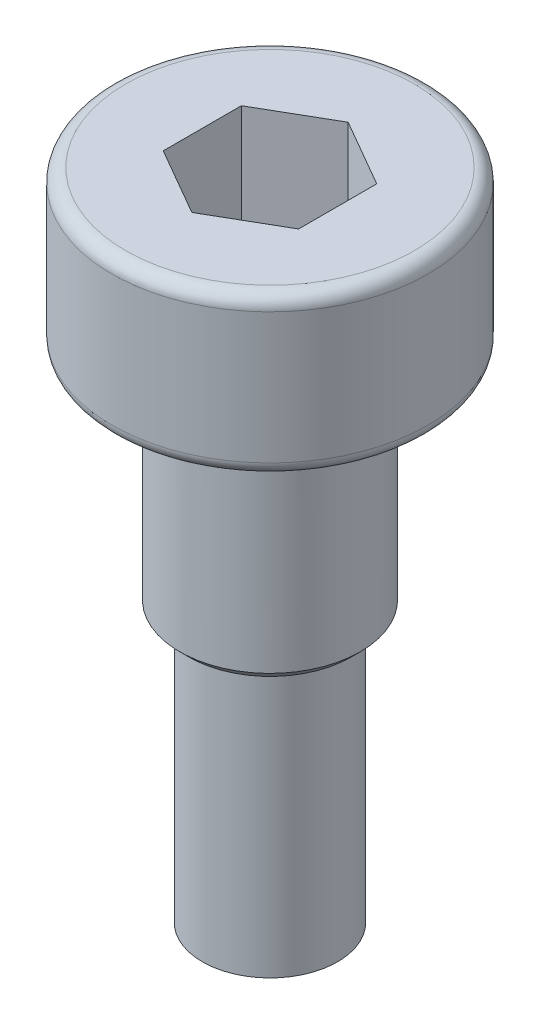
ISO-10303-21;
HEADER;
FILE_DESCRIPTION(('STEP AP214'),'2;1');
FILE_NAME('part.step','',(''),(''),'','','');
FILE_SCHEMA(('AUTOMOTIVE_DESIGN { 1 0 10303 214 1 1 1 1 }'));
ENDSEC;
DATA;
#1=APPLICATION_CONTEXT('core data for automotive mechanical design processes');
#2=APPLICATION_PROTOCOL_DEFINITION('international standard','automotive_design',2000,#1);
#3=PRODUCT_CONTEXT('',#1,'mechanical');
#4=PRODUCT('Part','Part','',(#3));
#5=PRODUCT_RELATED_PRODUCT_CATEGORY('part','',(#4));
#6=PRODUCT_DEFINITION_FORMATION('','',#4);
#7=PRODUCT_DEFINITION_CONTEXT('part definition',#1,'design');
#8=PRODUCT_DEFINITION('design','',#6,#7);
#9=PRODUCT_DEFINITION_SHAPE('','',#8);
#10=(LENGTH_UNIT() NAMED_UNIT(*) SI_UNIT(.MILLI.,.METRE.));
#11=(NAMED_UNIT(*) PLANE_ANGLE_UNIT() SI_UNIT($,.RADIAN.));
#12=(NAMED_UNIT(*) SI_UNIT($,.STERADIAN.) SOLID_ANGLE_UNIT());
#13=UNCERTAINTY_MEASURE_WITH_UNIT(LENGTH_MEASURE(1.E-05),#10,'distance_accuracy_value','');
#14=(GEOMETRIC_REPRESENTATION_CONTEXT(3) GLOBAL_UNCERTAINTY_ASSIGNED_CONTEXT((#13)) GLOBAL_UNIT_ASSIGNED_CONTEXT((#10,
#11,#12)) REPRESENTATION_CONTEXT('',''));
#15=CARTESIAN_POINT('',(0.,0.,0.));
#16=DIRECTION('',(0.,0.,1.));
#17=DIRECTION('',(1.,0.,0.));
#18=AXIS2_PLACEMENT_3D('',#15,#16,#17);
#19=CARTESIAN_POINT('',(0.,3.5,0.));
#20=DIRECTION('',(0.,1.,0.));
#21=DIRECTION('',(-1.,0.,0.));
#22=AXIS2_PLACEMENT_3D('',#19,#20,#21);
#23=PLANE('',#22);
#24=DIRECTION('',(-0.866025403784439,0.,-0.5));
#25=VECTOR('',#24,1.);
#26=CARTESIAN_POINT('',(1.5,3.5,-0.86602540378444));
#27=LINE('',#26,#25);
#28=CARTESIAN_POINT('',(1.5,3.5,-0.86602540378444));
#29=VERTEX_POINT('',#28);
#30=CARTESIAN_POINT('',(0.,3.5,-1.73205080756888));
#31=VERTEX_POINT('',#30);
#32=EDGE_CURVE('E57',#29,#31,#27,.T.);
#33=ORIENTED_EDGE('',*,*,#32,.F.);
#34=DIRECTION('',(0.,0.,-1.));
#35=VECTOR('',#34,1.);
#36=CARTESIAN_POINT('',(1.5,3.5,0.866025403784439));
#37=LINE('',#36,#35);
#38=CARTESIAN_POINT('',(1.5,3.5,0.866025403784439));
#39=VERTEX_POINT('',#38);
#40=EDGE_CURVE('E140',#39,#29,#37,.T.);
#41=ORIENTED_EDGE('',*,*,#40,.F.);
#42=DIRECTION('',(0.866025403784439,0.,-0.5));
#43=VECTOR('',#42,1.);
#44=CARTESIAN_POINT('',(0.,3.5,1.73205080756888));
#45=LINE('',#44,#43);
#46=CARTESIAN_POINT('',(0.,3.5,1.73205080756888));
#47=VERTEX_POINT('',#46);
#48=EDGE_CURVE('E138',#47,#39,#45,.T.);
#49=ORIENTED_EDGE('',*,*,#48,.F.);
#50=DIRECTION('',(0.866025403784438,0.,0.5));
#51=VECTOR('',#50,1.);
#52=CARTESIAN_POINT('',(-1.5,3.5,0.866025403784439));
#53=LINE('',#52,#51);
#54=CARTESIAN_POINT('',(-1.5,3.5,0.866025403784439));
#55=VERTEX_POINT('',#54);
#56=EDGE_CURVE('E105',#55,#47,#53,.T.);
#57=ORIENTED_EDGE('',*,*,#56,.F.);
#58=DIRECTION('',(0.,0.,1.));
#59=VECTOR('',#58,1.);
#60=CARTESIAN_POINT('',(-1.5,3.5,-0.866025403784439));
#61=LINE('',#60,#59);
#62=CARTESIAN_POINT('',(-1.5,3.5,-0.866025403784439));
#63=VERTEX_POINT('',#62);
#64=EDGE_CURVE('E134',#63,#55,#61,.T.);
#65=ORIENTED_EDGE('',*,*,#64,.F.);
#66=DIRECTION('',(-0.866025403784439,0.,0.5));
#67=VECTOR('',#66,1.);
#68=CARTESIAN_POINT('',(0.,3.5,-1.73205080756888));
#69=LINE('',#68,#67);
#70=EDGE_CURVE('E131',#31,#63,#69,.T.);
#71=ORIENTED_EDGE('',*,*,#70,.F.);
#72=EDGE_LOOP('',(#33,#41,#49,#57,#65,#71));
#73=FACE_BOUND('',#72,.T.);
#74=CARTESIAN_POINT('',(0.,3.5,0.));
#75=DIRECTION('',(0.,1.,0.));
#76=DIRECTION('',(-1.,0.,0.));
#77=AXIS2_PLACEMENT_3D('',#74,#75,#76);
#78=CIRCLE('',#77,3.2);
#79=CARTESIAN_POINT('',(-3.2,3.5,0.));
#80=VERTEX_POINT('',#79);
#81=EDGE_CURVE('E167',#80,#80,#78,.T.);
#82=ORIENTED_EDGE('',*,*,#81,.T.);
#83=EDGE_LOOP('',(#82));
#84=FACE_BOUND('',#83,.T.);
#85=ADVANCED_FACE('F41',(#73,#84),#23,.T.);
#86=CARTESIAN_POINT('',(0.,3.5,0.));
#87=DIRECTION('',(0.,1.,0.));
#88=DIRECTION('',(-1.,0.,0.));
#89=AXIS2_PLACEMENT_3D('',#86,#87,#88);
#90=CYLINDRICAL_SURFACE('',#89,3.5);
#91=CARTESIAN_POINT('',(0.,0.3,0.));
#92=DIRECTION('',(0.,-1.,0.));
#93=DIRECTION('',(1.,0.,0.));
#94=AXIS2_PLACEMENT_3D('',#91,#92,#93);
#95=CIRCLE('',#94,3.5);
#96=CARTESIAN_POINT('',(3.5,0.3,0.));
#97=VERTEX_POINT('',#96);
#98=EDGE_CURVE('E161',#97,#97,#95,.F.);
#99=ORIENTED_EDGE('',*,*,#98,.T.);
#100=EDGE_LOOP('',(#99));
#101=FACE_BOUND('',#100,.T.);
#102=CARTESIAN_POINT('',(0.,3.2,0.));
#103=DIRECTION('',(0.,1.,0.));
#104=DIRECTION('',(-1.,0.,0.));
#105=AXIS2_PLACEMENT_3D('',#102,#103,#104);
#106=CIRCLE('',#105,3.5);
#107=CARTESIAN_POINT('',(-3.5,3.2,0.));
#108=VERTEX_POINT('',#107);
#109=EDGE_CURVE('E158',#108,#108,#106,.F.);
#110=ORIENTED_EDGE('',*,*,#109,.T.);
#111=EDGE_LOOP('',(#110));
#112=FACE_BOUND('',#111,.T.);
#113=ADVANCED_FACE('F184',(#101,#112),#90,.T.);
#114=CARTESIAN_POINT('',(-3.5,0.,0.));
#115=DIRECTION('',(0.,-1.,0.));
#116=DIRECTION('',(1.,0.,0.));
#117=AXIS2_PLACEMENT_3D('',#114,#115,#116);
#118=PLANE('',#117);
#119=CARTESIAN_POINT('',(0.,0.,0.));
#120=DIRECTION('',(0.,-1.,0.));
#121=DIRECTION('',(1.,0.,0.));
#122=AXIS2_PLACEMENT_3D('',#119,#120,#121);
#123=CIRCLE('',#122,3.2);
#124=CARTESIAN_POINT('',(3.2,0.,0.));
#125=VERTEX_POINT('',#124);
#126=EDGE_CURVE('E164',#125,#125,#123,.T.);
#127=ORIENTED_EDGE('',*,*,#126,.T.);
#128=EDGE_LOOP('',(#127));
#129=FACE_BOUND('',#128,.T.);
#130=CARTESIAN_POINT('',(0.,0.,0.));
#131=DIRECTION('',(0.,1.,0.));
#132=DIRECTION('',(-1.,0.,0.));
#133=AXIS2_PLACEMENT_3D('',#130,#131,#132);
#134=CIRCLE('',#133,2.);
#135=CARTESIAN_POINT('',(-2.,0.,0.));
#136=VERTEX_POINT('',#135);
#137=EDGE_CURVE('E155',#136,#136,#134,.T.);
#138=ORIENTED_EDGE('',*,*,#137,.T.);
#139=EDGE_LOOP('',(#138));
#140=FACE_BOUND('',#139,.T.);
#141=ADVANCED_FACE('F190',(#129,#140),#118,.T.);
#142=CARTESIAN_POINT('',(0.,3.5,0.));
#143=DIRECTION('',(0.,1.,0.));
#144=DIRECTION('',(-1.,0.,0.));
#145=AXIS2_PLACEMENT_3D('',#142,#143,#144);
#146=CYLINDRICAL_SURFACE('',#145,2.);
#147=CARTESIAN_POINT('',(0.,-4.8,0.));
#148=DIRECTION('',(0.,-1.,0.));
#149=DIRECTION('',(1.,0.,0.));
#150=AXIS2_PLACEMENT_3D('',#147,#148,#149);
#151=CIRCLE('',#150,2.);
#152=CARTESIAN_POINT('',(2.,-4.8,0.));
#153=VERTEX_POINT('',#152);
#154=EDGE_CURVE('E50',#153,#153,#151,.F.);
#155=ORIENTED_EDGE('',*,*,#154,.T.);
#156=EDGE_LOOP('',(#155));
#157=FACE_BOUND('',#156,.T.);
#158=ORIENTED_EDGE('',*,*,#137,.F.);
#159=EDGE_LOOP('',(#158));
#160=FACE_BOUND('',#159,.T.);
#161=ADVANCED_FACE('F172',(#157,#160),#146,.T.);
#162=CARTESIAN_POINT('',(-2.,-5.,0.));
#163=DIRECTION('',(0.,-1.,0.));
#164=DIRECTION('',(1.,0.,0.));
#165=AXIS2_PLACEMENT_3D('',#162,#163,#164);
#166=PLANE('',#165);
#167=CARTESIAN_POINT('',(0.,-5.,0.));
#168=DIRECTION('',(0.,-1.,0.));
#169=DIRECTION('',(1.,0.,0.));
#170=AXIS2_PLACEMENT_3D('',#167,#168,#169);
#171=CIRCLE('',#170,1.8);
#172=CARTESIAN_POINT('',(1.8,-5.,0.));
#173=VERTEX_POINT('',#172);
#174=EDGE_CURVE('E11',#173,#173,#171,.T.);
#175=ORIENTED_EDGE('',*,*,#174,.T.);
#176=EDGE_LOOP('',(#175));
#177=FACE_BOUND('',#176,.T.);
#178=CARTESIAN_POINT('',(0.,-5.,0.));
#179=DIRECTION('',(0.,1.,0.));
#180=DIRECTION('',(-1.,0.,0.));
#181=AXIS2_PLACEMENT_3D('',#178,#179,#180);
#182=CIRCLE('',#181,1.5);
#183=CARTESIAN_POINT('',(-1.5,-5.,0.));
#184=VERTEX_POINT('',#183);
#185=EDGE_CURVE('E152',#184,#184,#182,.T.);
#186=ORIENTED_EDGE('',*,*,#185,.T.);
#187=EDGE_LOOP('',(#186));
#188=FACE_BOUND('',#187,.T.);
#189=ADVANCED_FACE('F226',(#177,#188),#166,.T.);
#190=CARTESIAN_POINT('',(0.,3.5,0.));
#191=DIRECTION('',(0.,1.,0.));
#192=DIRECTION('',(-1.,0.,0.));
#193=AXIS2_PLACEMENT_3D('',#190,#191,#192);
#194=CYLINDRICAL_SURFACE('',#193,1.5);
#195=CARTESIAN_POINT('',(0.,-11.,0.));
#196=DIRECTION('',(0.,1.,0.));
#197=DIRECTION('',(-1.,0.,0.));
#198=AXIS2_PLACEMENT_3D('',#195,#196,#197);
#199=CIRCLE('',#198,1.5);
#200=CARTESIAN_POINT('',(-1.5,-11.,0.));
#201=VERTEX_POINT('',#200);
#202=EDGE_CURVE('E144',#201,#201,#199,.T.);
#203=ORIENTED_EDGE('',*,*,#202,.T.);
#204=EDGE_LOOP('',(#203));
#205=FACE_BOUND('',#204,.T.);
#206=ORIENTED_EDGE('',*,*,#185,.F.);
#207=EDGE_LOOP('',(#206));
#208=FACE_BOUND('',#207,.T.);
#209=ADVANCED_FACE('F222',(#205,#208),#194,.T.);
#210=CARTESIAN_POINT('',(-1.5,-11.,0.));
#211=DIRECTION('',(0.,-1.,0.));
#212=DIRECTION('',(1.,0.,0.));
#213=AXIS2_PLACEMENT_3D('',#210,#211,#212);
#214=PLANE('',#213);
#215=ORIENTED_EDGE('',*,*,#202,.F.);
#216=EDGE_LOOP('',(#215));
#217=FACE_BOUND('',#216,.T.);
#218=ADVANCED_FACE('F199',(#217),#214,.T.);
#219=CARTESIAN_POINT('',(0.,0.3,0.));
#220=DIRECTION('',(0.,-1.,0.));
#221=DIRECTION('',(1.,0.,0.));
#222=AXIS2_PLACEMENT_3D('',#219,#220,#221);
#223=TOROIDAL_SURFACE('',#222,3.2,0.3);
#224=ORIENTED_EDGE('',*,*,#126,.F.);
#225=EDGE_LOOP('',(#224));
#226=FACE_BOUND('',#225,.T.);
#227=ORIENTED_EDGE('',*,*,#98,.F.);
#228=EDGE_LOOP('',(#227));
#229=FACE_BOUND('',#228,.T.);
#230=ADVANCED_FACE('F196',(#226,#229),#223,.T.);
#231=CARTESIAN_POINT('',(0.,3.2,0.));
#232=DIRECTION('',(0.,1.,0.));
#233=DIRECTION('',(-1.,0.,0.));
#234=AXIS2_PLACEMENT_3D('',#231,#232,#233);
#235=TOROIDAL_SURFACE('',#234,3.2,0.3);
#236=ORIENTED_EDGE('',*,*,#109,.F.);
#237=EDGE_LOOP('',(#236));
#238=FACE_BOUND('',#237,.T.);
#239=ORIENTED_EDGE('',*,*,#81,.F.);
#240=EDGE_LOOP('',(#239));
#241=FACE_BOUND('',#240,.T.);
#242=ADVANCED_FACE('F198',(#238,#241),#235,.T.);
#243=CARTESIAN_POINT('',(1.5,1.1,-0.86602540378444));
#244=DIRECTION('',(0.5,0.,-0.866025403784439));
#245=DIRECTION('',(-0.866025403784439,0.,-0.5));
#246=AXIS2_PLACEMENT_3D('',#243,#244,#245);
#247=PLANE('',#246);
#248=ORIENTED_EDGE('',*,*,#32,.T.);
#249=DIRECTION('',(0.,1.,0.));
#250=VECTOR('',#249,1.);
#251=CARTESIAN_POINT('',(0.,1.1,-1.73205080756888));
#252=LINE('',#251,#250);
#253=CARTESIAN_POINT('',(0.,1.1,-1.73205080756888));
#254=VERTEX_POINT('',#253);
#255=EDGE_CURVE('E87',#254,#31,#252,.T.);
#256=ORIENTED_EDGE('',*,*,#255,.F.);
#257=DIRECTION('',(-0.866025403784439,0.,-0.5));
#258=VECTOR('',#257,1.);
#259=CARTESIAN_POINT('',(1.5,1.1,-0.86602540378444));
#260=LINE('',#259,#258);
#261=CARTESIAN_POINT('',(1.5,1.1,-0.86602540378444));
#262=VERTEX_POINT('',#261);
#263=EDGE_CURVE('E142',#262,#254,#260,.T.);
#264=ORIENTED_EDGE('',*,*,#263,.F.);
#265=DIRECTION('',(0.,1.,0.));
#266=VECTOR('',#265,1.);
#267=CARTESIAN_POINT('',(1.5,1.1,-0.86602540378444));
#268=LINE('',#267,#266);
#269=EDGE_CURVE('E65',#262,#29,#268,.T.);
#270=ORIENTED_EDGE('',*,*,#269,.T.);
#271=EDGE_LOOP('',(#248,#256,#264,#270));
#272=FACE_BOUND('',#271,.T.);
#273=ADVANCED_FACE('F202',(#272),#247,.F.);
#274=CARTESIAN_POINT('',(1.5,1.1,0.866025403784439));
#275=DIRECTION('',(1.,0.,0.));
#276=DIRECTION('',(0.,1.,0.));
#277=AXIS2_PLACEMENT_3D('',#274,#275,#276);
#278=PLANE('',#277);
#279=ORIENTED_EDGE('',*,*,#40,.T.);
#280=ORIENTED_EDGE('',*,*,#269,.F.);
#281=DIRECTION('',(0.,0.,-1.));
#282=VECTOR('',#281,1.);
#283=CARTESIAN_POINT('',(1.5,1.1,0.866025403784439));
#284=LINE('',#283,#282);
#285=CARTESIAN_POINT('',(1.5,1.1,0.866025403784439));
#286=VERTEX_POINT('',#285);
#287=EDGE_CURVE('E117',#286,#262,#284,.T.);
#288=ORIENTED_EDGE('',*,*,#287,.F.);
#289=DIRECTION('',(0.,1.,0.));
#290=VECTOR('',#289,1.);
#291=CARTESIAN_POINT('',(1.5,1.1,0.866025403784439));
#292=LINE('',#291,#290);
#293=EDGE_CURVE('E109',#286,#39,#292,.T.);
#294=ORIENTED_EDGE('',*,*,#293,.T.);
#295=EDGE_LOOP('',(#279,#280,#288,#294));
#296=FACE_BOUND('',#295,.T.);
#297=ADVANCED_FACE('F207',(#296),#278,.F.);
#298=CARTESIAN_POINT('',(0.,1.1,1.73205080756888));
#299=DIRECTION('',(0.5,0.,0.866025403784439));
#300=DIRECTION('',(0.866025403784439,0.,-0.5));
#301=AXIS2_PLACEMENT_3D('',#298,#299,#300);
#302=PLANE('',#301);
#303=ORIENTED_EDGE('',*,*,#48,.T.);
#304=ORIENTED_EDGE('',*,*,#293,.F.);
#305=DIRECTION('',(0.866025403784439,0.,-0.5));
#306=VECTOR('',#305,1.);
#307=CARTESIAN_POINT('',(0.,1.1,1.73205080756888));
#308=LINE('',#307,#306);
#309=CARTESIAN_POINT('',(0.,1.1,1.73205080756888));
#310=VERTEX_POINT('',#309);
#311=EDGE_CURVE('E113',#310,#286,#308,.T.);
#312=ORIENTED_EDGE('',*,*,#311,.F.);
#313=DIRECTION('',(0.,1.,0.));
#314=VECTOR('',#313,1.);
#315=CARTESIAN_POINT('',(0.,1.1,1.73205080756888));
#316=LINE('',#315,#314);
#317=EDGE_CURVE('E98',#310,#47,#316,.T.);
#318=ORIENTED_EDGE('',*,*,#317,.T.);
#319=EDGE_LOOP('',(#303,#304,#312,#318));
#320=FACE_BOUND('',#319,.T.);
#321=ADVANCED_FACE('F114',(#320),#302,.F.);
#322=CARTESIAN_POINT('',(-1.5,1.1,0.866025403784439));
#323=DIRECTION('',(-0.5,0.,0.866025403784439));
#324=DIRECTION('',(0.866025403784439,0.,0.5));
#325=AXIS2_PLACEMENT_3D('',#322,#323,#324);
#326=PLANE('',#325);
#327=ORIENTED_EDGE('',*,*,#56,.T.);
#328=ORIENTED_EDGE('',*,*,#317,.F.);
#329=DIRECTION('',(0.866025403784438,0.,0.5));
#330=VECTOR('',#329,1.);
#331=CARTESIAN_POINT('',(-1.5,1.1,0.866025403784439));
#332=LINE('',#331,#330);
#333=CARTESIAN_POINT('',(-1.5,1.1,0.866025403784439));
#334=VERTEX_POINT('',#333);
#335=EDGE_CURVE('E102',#334,#310,#332,.T.);
#336=ORIENTED_EDGE('',*,*,#335,.F.);
#337=DIRECTION('',(0.,1.,0.));
#338=VECTOR('',#337,1.);
#339=CARTESIAN_POINT('',(-1.5,1.1,0.866025403784439));
#340=LINE('',#339,#338);
#341=EDGE_CURVE('E110',#334,#55,#340,.T.);
#342=ORIENTED_EDGE('',*,*,#341,.T.);
#343=EDGE_LOOP('',(#327,#328,#336,#342));
#344=FACE_BOUND('',#343,.T.);
#345=ADVANCED_FACE('F100',(#344),#326,.F.);
#346=CARTESIAN_POINT('',(-1.5,1.1,-0.866025403784439));
#347=DIRECTION('',(-1.,0.,0.));
#348=DIRECTION('',(0.,-1.,0.));
#349=AXIS2_PLACEMENT_3D('',#346,#347,#348);
#350=PLANE('',#349);
#351=ORIENTED_EDGE('',*,*,#64,.T.);
#352=ORIENTED_EDGE('',*,*,#341,.F.);
#353=DIRECTION('',(0.,0.,1.));
#354=VECTOR('',#353,1.);
#355=CARTESIAN_POINT('',(-1.5,1.1,-0.866025403784439));
#356=LINE('',#355,#354);
#357=CARTESIAN_POINT('',(-1.5,1.1,-0.866025403784439));
#358=VERTEX_POINT('',#357);
#359=EDGE_CURVE('E123',#358,#334,#356,.T.);
#360=ORIENTED_EDGE('',*,*,#359,.F.);
#361=DIRECTION('',(0.,1.,0.));
#362=VECTOR('',#361,1.);
#363=CARTESIAN_POINT('',(-1.5,1.1,-0.866025403784439));
#364=LINE('',#363,#362);
#365=EDGE_CURVE('E147',#358,#63,#364,.T.);
#366=ORIENTED_EDGE('',*,*,#365,.T.);
#367=EDGE_LOOP('',(#351,#352,#360,#366));
#368=FACE_BOUND('',#367,.T.);
#369=ADVANCED_FACE('F302',(#368),#350,.F.);
#370=CARTESIAN_POINT('',(0.,1.1,-1.73205080756888));
#371=DIRECTION('',(-0.5,0.,-0.866025403784439));
#372=DIRECTION('',(-0.866025403784439,0.,0.5));
#373=AXIS2_PLACEMENT_3D('',#370,#371,#372);
#374=PLANE('',#373);
#375=ORIENTED_EDGE('',*,*,#70,.T.);
#376=ORIENTED_EDGE('',*,*,#365,.F.);
#377=DIRECTION('',(-0.866025403784439,0.,0.5));
#378=VECTOR('',#377,1.);
#379=CARTESIAN_POINT('',(0.,1.1,-1.73205080756888));
#380=LINE('',#379,#378);
#381=EDGE_CURVE('E125',#254,#358,#380,.T.);
#382=ORIENTED_EDGE('',*,*,#381,.F.);
#383=ORIENTED_EDGE('',*,*,#255,.T.);
#384=EDGE_LOOP('',(#375,#376,#382,#383));
#385=FACE_BOUND('',#384,.T.);
#386=ADVANCED_FACE('F180',(#385),#374,.F.);
#387=CARTESIAN_POINT('',(0.,1.1,0.));
#388=DIRECTION('',(0.,1.,0.));
#389=DIRECTION('',(0.,0.,1.));
#390=AXIS2_PLACEMENT_3D('',#387,#388,#389);
#391=PLANE('',#390);
#392=ORIENTED_EDGE('',*,*,#263,.T.);
#393=ORIENTED_EDGE('',*,*,#381,.T.);
#394=ORIENTED_EDGE('',*,*,#359,.T.);
#395=ORIENTED_EDGE('',*,*,#335,.T.);
#396=ORIENTED_EDGE('',*,*,#311,.T.);
#397=ORIENTED_EDGE('',*,*,#287,.T.);
#398=EDGE_LOOP('',(#392,#393,#394,#395,#396,#397));
#399=FACE_BOUND('',#398,.T.);
#400=ADVANCED_FACE('F120',(#399),#391,.T.);
#401=CARTESIAN_POINT('',(0.,-4.8,0.));
#402=DIRECTION('',(0.,1.,0.));
#403=DIRECTION('',(-1.,0.,0.));
#404=AXIS2_PLACEMENT_3D('',#401,#402,#403);
#405=CONICAL_SURFACE('',#404,2.,0.785398163397455);
#406=ORIENTED_EDGE('',*,*,#174,.F.);
#407=EDGE_LOOP('',(#406));
#408=FACE_BOUND('',#407,.T.);
#409=ORIENTED_EDGE('',*,*,#154,.F.);
#410=EDGE_LOOP('',(#409));
#411=FACE_BOUND('',#410,.T.);
#412=ADVANCED_FACE('F44',(#408,#411),#405,.T.);
#413=CLOSED_SHELL('',(#85,#113,#141,#161,#189,#209,#218,#230,#242,#273,#297,#321,#345,#369,#386,
#400,#412));
#414=MANIFOLD_SOLID_BREP('B2',#413);
#415=ADVANCED_BREP_SHAPE_REPRESENTATION('',(#18,#414),#14);
#416=SHAPE_DEFINITION_REPRESENTATION(#9,#415);
ENDSEC;
END-ISO-10303-21;
